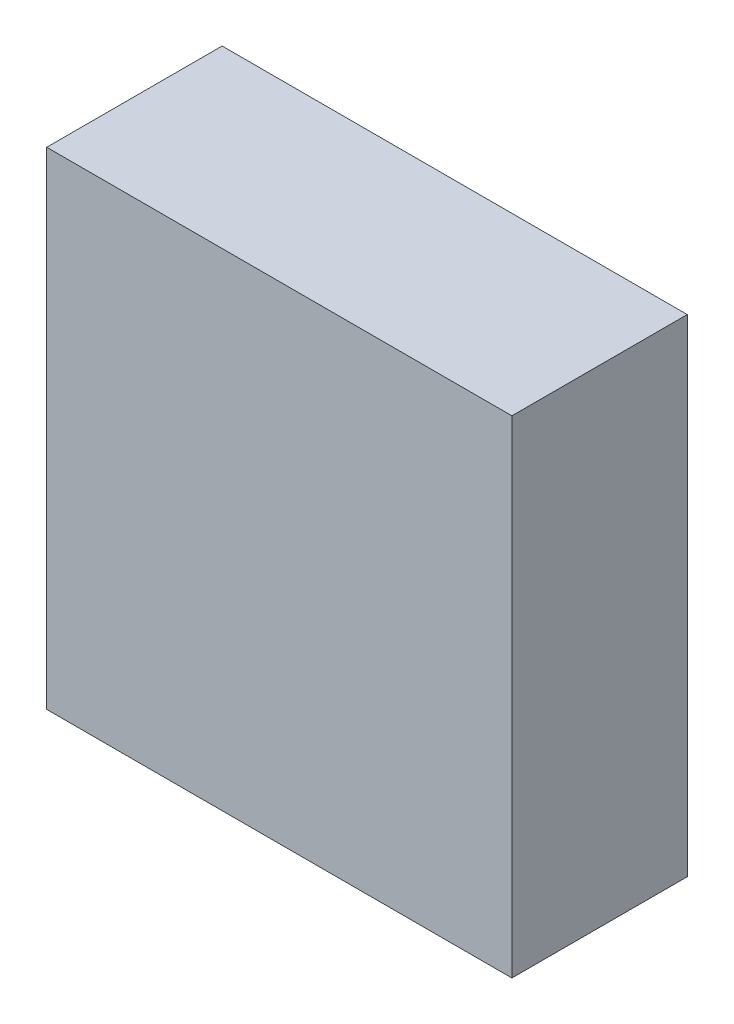
ISO-10303-21;
HEADER;
FILE_DESCRIPTION(('STEP AP214'),'2;1');
FILE_NAME('part.step','',(''),(''),'','','');
FILE_SCHEMA(('AUTOMOTIVE_DESIGN { 1 0 10303 214 1 1 1 1 }'));
ENDSEC;
DATA;
#1=APPLICATION_CONTEXT('core data for automotive mechanical design processes');
#2=APPLICATION_PROTOCOL_DEFINITION('international standard','automotive_design',2000,#1);
#3=PRODUCT_CONTEXT('',#1,'mechanical');
#4=PRODUCT('Part','Part','',(#3));
#5=PRODUCT_RELATED_PRODUCT_CATEGORY('part','',(#4));
#6=PRODUCT_DEFINITION_FORMATION('','',#4);
#7=PRODUCT_DEFINITION_CONTEXT('part definition',#1,'design');
#8=PRODUCT_DEFINITION('design','',#6,#7);
#9=PRODUCT_DEFINITION_SHAPE('','',#8);
#10=(LENGTH_UNIT() NAMED_UNIT(*) SI_UNIT(.MILLI.,.METRE.));
#11=(NAMED_UNIT(*) PLANE_ANGLE_UNIT() SI_UNIT($,.RADIAN.));
#12=(NAMED_UNIT(*) SI_UNIT($,.STERADIAN.) SOLID_ANGLE_UNIT());
#13=UNCERTAINTY_MEASURE_WITH_UNIT(LENGTH_MEASURE(1.E-05),#10,'distance_accuracy_value','');
#14=(GEOMETRIC_REPRESENTATION_CONTEXT(3) GLOBAL_UNCERTAINTY_ASSIGNED_CONTEXT((#13)) GLOBAL_UNIT_ASSIGNED_CONTEXT((#10,
#11,#12)) REPRESENTATION_CONTEXT('',''));
#15=CARTESIAN_POINT('',(0.,0.,0.));
#16=DIRECTION('',(0.,0.,1.));
#17=DIRECTION('',(1.,0.,0.));
#18=AXIS2_PLACEMENT_3D('',#15,#16,#17);
#19=CARTESIAN_POINT('',(-1.3262,-1.35,1.));
#20=DIRECTION('',(1.,0.,0.));
#21=DIRECTION('',(0.,0.,-1.));
#22=AXIS2_PLACEMENT_3D('',#19,#20,#21);
#23=PLANE('',#22);
#24=DIRECTION('',(0.,-1.,0.));
#25=VECTOR('',#24,1.);
#26=CARTESIAN_POINT('',(-1.3262,-1.35,0.));
#27=LINE('',#26,#25);
#28=CARTESIAN_POINT('',(-1.3262,1.4262,0.));
#29=VERTEX_POINT('',#28);
#30=CARTESIAN_POINT('',(-1.3262,-1.35,0.));
#31=VERTEX_POINT('',#30);
#32=EDGE_CURVE('E96',#29,#31,#27,.T.);
#33=ORIENTED_EDGE('',*,*,#32,.T.);
#34=DIRECTION('',(0.,0.,-1.));
#35=VECTOR('',#34,1.);
#36=CARTESIAN_POINT('',(-1.3262,-1.35,1.));
#37=LINE('',#36,#35);
#38=CARTESIAN_POINT('',(-1.3262,-1.35,1.));
#39=VERTEX_POINT('',#38);
#40=EDGE_CURVE('E11',#39,#31,#37,.T.);
#41=ORIENTED_EDGE('',*,*,#40,.F.);
#42=DIRECTION('',(0.,-1.,0.));
#43=VECTOR('',#42,1.);
#44=CARTESIAN_POINT('',(-1.3262,-1.35,1.));
#45=LINE('',#44,#43);
#46=CARTESIAN_POINT('',(-1.3262,1.4262,1.));
#47=VERTEX_POINT('',#46);
#48=EDGE_CURVE('E84',#47,#39,#45,.T.);
#49=ORIENTED_EDGE('',*,*,#48,.F.);
#50=DIRECTION('',(0.,0.,-1.));
#51=VECTOR('',#50,1.);
#52=CARTESIAN_POINT('',(-1.3262,1.4262,1.));
#53=LINE('',#52,#51);
#54=EDGE_CURVE('E92',#47,#29,#53,.T.);
#55=ORIENTED_EDGE('',*,*,#54,.T.);
#56=EDGE_LOOP('',(#33,#41,#49,#55));
#57=FACE_BOUND('',#56,.T.);
#58=ADVANCED_FACE('F33',(#57),#23,.F.);
#59=CARTESIAN_POINT('',(1.3262,-1.35,1.));
#60=DIRECTION('',(0.,1.,0.));
#61=DIRECTION('',(0.,0.,1.));
#62=AXIS2_PLACEMENT_3D('',#59,#60,#61);
#63=PLANE('',#62);
#64=DIRECTION('',(1.,0.,0.));
#65=VECTOR('',#64,1.);
#66=CARTESIAN_POINT('',(1.3262,-1.35,0.));
#67=LINE('',#66,#65);
#68=CARTESIAN_POINT('',(1.3262,-1.35,0.));
#69=VERTEX_POINT('',#68);
#70=EDGE_CURVE('E88',#31,#69,#67,.T.);
#71=ORIENTED_EDGE('',*,*,#70,.T.);
#72=DIRECTION('',(0.,0.,-1.));
#73=VECTOR('',#72,1.);
#74=CARTESIAN_POINT('',(1.3262,-1.35,1.));
#75=LINE('',#74,#73);
#76=CARTESIAN_POINT('',(1.3262,-1.35,1.));
#77=VERTEX_POINT('',#76);
#78=EDGE_CURVE('E41',#77,#69,#75,.T.);
#79=ORIENTED_EDGE('',*,*,#78,.F.);
#80=DIRECTION('',(1.,0.,0.));
#81=VECTOR('',#80,1.);
#82=CARTESIAN_POINT('',(1.3262,-1.35,1.));
#83=LINE('',#82,#81);
#84=EDGE_CURVE('E79',#39,#77,#83,.T.);
#85=ORIENTED_EDGE('',*,*,#84,.F.);
#86=ORIENTED_EDGE('',*,*,#40,.T.);
#87=EDGE_LOOP('',(#71,#79,#85,#86));
#88=FACE_BOUND('',#87,.T.);
#89=ADVANCED_FACE('F87',(#88),#63,.F.);
#90=CARTESIAN_POINT('',(1.3262,1.4262,1.));
#91=DIRECTION('',(-1.,0.,0.));
#92=DIRECTION('',(0.,0.,1.));
#93=AXIS2_PLACEMENT_3D('',#90,#91,#92);
#94=PLANE('',#93);
#95=DIRECTION('',(0.,1.,0.));
#96=VECTOR('',#95,1.);
#97=CARTESIAN_POINT('',(1.3262,1.4262,0.));
#98=LINE('',#97,#96);
#99=CARTESIAN_POINT('',(1.3262,1.4262,0.));
#100=VERTEX_POINT('',#99);
#101=EDGE_CURVE('E66',#69,#100,#98,.T.);
#102=ORIENTED_EDGE('',*,*,#101,.T.);
#103=DIRECTION('',(0.,0.,-1.));
#104=VECTOR('',#103,1.);
#105=CARTESIAN_POINT('',(1.3262,1.4262,1.));
#106=LINE('',#105,#104);
#107=CARTESIAN_POINT('',(1.3262,1.4262,1.));
#108=VERTEX_POINT('',#107);
#109=EDGE_CURVE('E89',#108,#100,#106,.T.);
#110=ORIENTED_EDGE('',*,*,#109,.F.);
#111=DIRECTION('',(0.,1.,0.));
#112=VECTOR('',#111,1.);
#113=CARTESIAN_POINT('',(1.3262,1.4262,1.));
#114=LINE('',#113,#112);
#115=EDGE_CURVE('E82',#77,#108,#114,.T.);
#116=ORIENTED_EDGE('',*,*,#115,.F.);
#117=ORIENTED_EDGE('',*,*,#78,.T.);
#118=EDGE_LOOP('',(#102,#110,#116,#117));
#119=FACE_BOUND('',#118,.T.);
#120=ADVANCED_FACE('F90',(#119),#94,.F.);
#121=CARTESIAN_POINT('',(-1.3262,1.4262,1.));
#122=DIRECTION('',(0.,-1.,0.));
#123=DIRECTION('',(0.,0.,-1.));
#124=AXIS2_PLACEMENT_3D('',#121,#122,#123);
#125=PLANE('',#124);
#126=DIRECTION('',(-1.,0.,0.));
#127=VECTOR('',#126,1.);
#128=CARTESIAN_POINT('',(-1.3262,1.4262,0.));
#129=LINE('',#128,#127);
#130=EDGE_CURVE('E72',#100,#29,#129,.T.);
#131=ORIENTED_EDGE('',*,*,#130,.T.);
#132=ORIENTED_EDGE('',*,*,#54,.F.);
#133=DIRECTION('',(-1.,0.,0.));
#134=VECTOR('',#133,1.);
#135=CARTESIAN_POINT('',(-1.3262,1.4262,1.));
#136=LINE('',#135,#134);
#137=EDGE_CURVE('E49',#108,#47,#136,.T.);
#138=ORIENTED_EDGE('',*,*,#137,.F.);
#139=ORIENTED_EDGE('',*,*,#109,.T.);
#140=EDGE_LOOP('',(#131,#132,#138,#139));
#141=FACE_BOUND('',#140,.T.);
#142=ADVANCED_FACE('F103',(#141),#125,.F.);
#143=CARTESIAN_POINT('',(0.,0.,1.));
#144=DIRECTION('',(0.,0.,-1.));
#145=DIRECTION('',(-1.,0.,0.));
#146=AXIS2_PLACEMENT_3D('',#143,#144,#145);
#147=PLANE('',#146);
#148=ORIENTED_EDGE('',*,*,#48,.T.);
#149=ORIENTED_EDGE('',*,*,#84,.T.);
#150=ORIENTED_EDGE('',*,*,#115,.T.);
#151=ORIENTED_EDGE('',*,*,#137,.T.);
#152=EDGE_LOOP('',(#148,#149,#150,#151));
#153=FACE_BOUND('',#152,.T.);
#154=ADVANCED_FACE('F80',(#153),#147,.F.);
#155=CARTESIAN_POINT('',(0.,0.,0.));
#156=DIRECTION('',(0.,0.,-1.));
#157=DIRECTION('',(-1.,0.,0.));
#158=AXIS2_PLACEMENT_3D('',#155,#156,#157);
#159=PLANE('',#158);
#160=ORIENTED_EDGE('',*,*,#32,.F.);
#161=ORIENTED_EDGE('',*,*,#130,.F.);
#162=ORIENTED_EDGE('',*,*,#101,.F.);
#163=ORIENTED_EDGE('',*,*,#70,.F.);
#164=EDGE_LOOP('',(#160,#161,#162,#163));
#165=FACE_BOUND('',#164,.T.);
#166=ADVANCED_FACE('F106',(#165),#159,.T.);
#167=CLOSED_SHELL('',(#58,#89,#120,#142,#154,#166));
#168=MANIFOLD_SOLID_BREP('B2',#167);
#169=ADVANCED_BREP_SHAPE_REPRESENTATION('',(#18,#168),#14);
#170=SHAPE_DEFINITION_REPRESENTATION(#9,#169);
ENDSEC;
END-ISO-10303-21;
